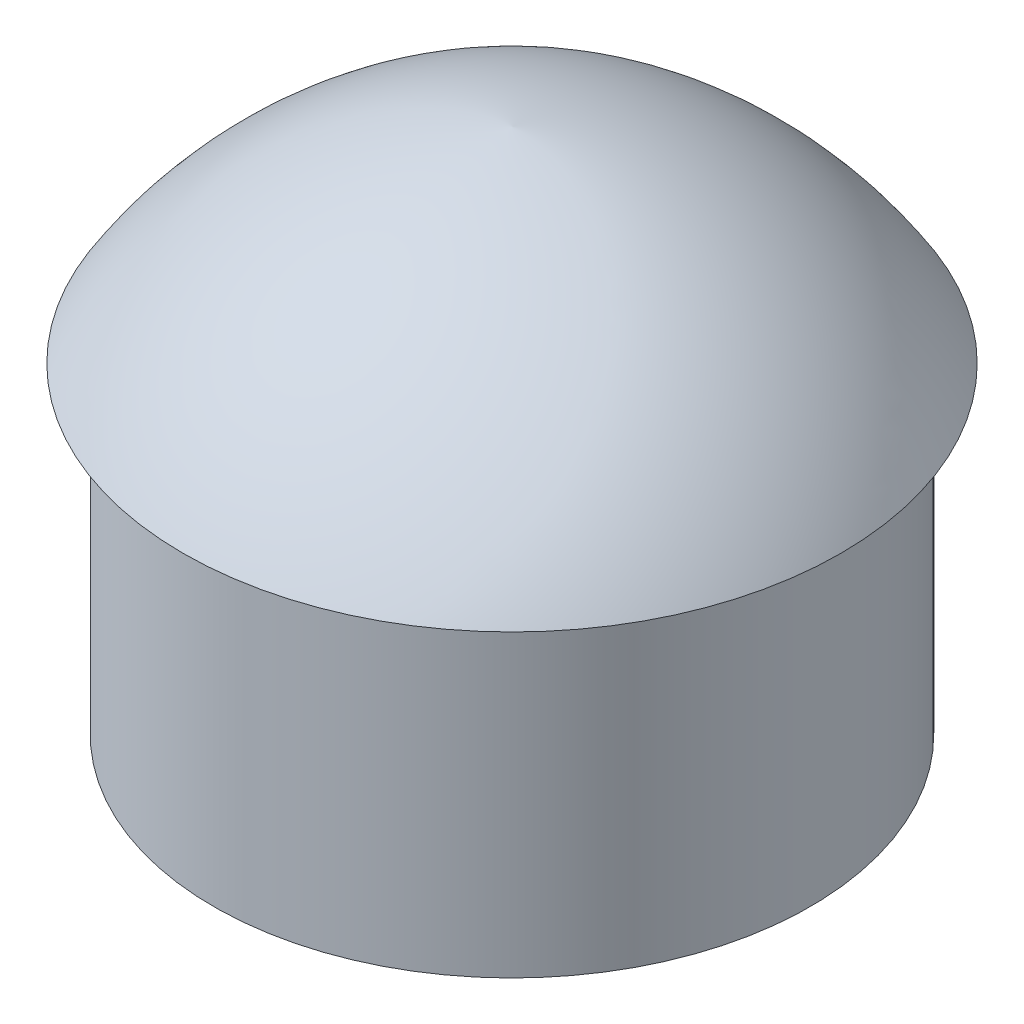
ISO-10303-21;
HEADER;
FILE_DESCRIPTION(('STEP AP214'),'2;1');
FILE_NAME('part.step','',(''),(''),'','','');
FILE_SCHEMA(('AUTOMOTIVE_DESIGN { 1 0 10303 214 1 1 1 1 }'));
ENDSEC;
DATA;
#1=APPLICATION_CONTEXT('core data for automotive mechanical design processes');
#2=APPLICATION_PROTOCOL_DEFINITION('international standard','automotive_design',2000,#1);
#3=PRODUCT_CONTEXT('',#1,'mechanical');
#4=PRODUCT('Part','Part','',(#3));
#5=PRODUCT_RELATED_PRODUCT_CATEGORY('part','',(#4));
#6=PRODUCT_DEFINITION_FORMATION('','',#4);
#7=PRODUCT_DEFINITION_CONTEXT('part definition',#1,'design');
#8=PRODUCT_DEFINITION('design','',#6,#7);
#9=PRODUCT_DEFINITION_SHAPE('','',#8);
#10=(LENGTH_UNIT() NAMED_UNIT(*) SI_UNIT(.MILLI.,.METRE.));
#11=(NAMED_UNIT(*) PLANE_ANGLE_UNIT() SI_UNIT($,.RADIAN.));
#12=(NAMED_UNIT(*) SI_UNIT($,.STERADIAN.) SOLID_ANGLE_UNIT());
#13=UNCERTAINTY_MEASURE_WITH_UNIT(LENGTH_MEASURE(1.E-05),#10,'distance_accuracy_value','');
#14=(GEOMETRIC_REPRESENTATION_CONTEXT(3) GLOBAL_UNCERTAINTY_ASSIGNED_CONTEXT((#13)) GLOBAL_UNIT_ASSIGNED_CONTEXT((#10,
#11,#12)) REPRESENTATION_CONTEXT('',''));
#15=CARTESIAN_POINT('',(0.,0.,0.));
#16=DIRECTION('',(0.,0.,1.));
#17=DIRECTION('',(1.,0.,0.));
#18=AXIS2_PLACEMENT_3D('',#15,#16,#17);
#19=CARTESIAN_POINT('',(13.6,2.65437936349018,0.));
#20=DIRECTION('',(0.,1.,0.));
#21=DIRECTION('',(-1.,0.,0.));
#22=AXIS2_PLACEMENT_3D('',#19,#20,#21);
#23=PLANE('',#22);
#24=CARTESIAN_POINT('',(0.,2.65437936349017,0.));
#25=DIRECTION('',(0.,1.,0.));
#26=DIRECTION('',(-1.,0.,0.));
#27=AXIS2_PLACEMENT_3D('',#24,#25,#26);
#28=CIRCLE('',#27,15.);
#29=CARTESIAN_POINT('',(-15.,2.65437936349017,0.));
#30=VERTEX_POINT('',#29);
#31=EDGE_CURVE('E11',#30,#30,#28,.T.);
#32=ORIENTED_EDGE('',*,*,#31,.F.);
#33=EDGE_LOOP('',(#32));
#34=FACE_BOUND('',#33,.T.);
#35=CARTESIAN_POINT('',(0.,2.65437936349017,0.));
#36=DIRECTION('',(0.,1.,0.));
#37=DIRECTION('',(-1.,0.,0.));
#38=AXIS2_PLACEMENT_3D('',#35,#36,#37);
#39=CIRCLE('',#38,13.6);
#40=CARTESIAN_POINT('',(-13.6,2.65437936349017,0.));
#41=VERTEX_POINT('',#40);
#42=EDGE_CURVE('E57',#41,#41,#39,.T.);
#43=ORIENTED_EDGE('',*,*,#42,.T.);
#44=EDGE_LOOP('',(#43));
#45=FACE_BOUND('',#44,.T.);
#46=ADVANCED_FACE('F40',(#34,#45),#23,.F.);
#47=CARTESIAN_POINT('',(1.98777575925086,-7.90097353224044,0.));
#48=DIRECTION('',(0.,0.,-1.));
#49=DIRECTION('',(-1.,0.,0.));
#50=AXIS2_PLACEMENT_3D('',#47,#48,#49);
#51=CIRCLE('',#50,20.);
#52=TRIMMED_CURVE('',#51,(PARAMETER_VALUE(-1.47124317792119)),
(PARAMETER_VALUE(1.47124317792119)),.T.,.PARAMETER.);
#53=CARTESIAN_POINT('',(0.,-7.90097353224044,0.));
#54=DIRECTION('',(0.,1.,0.));
#55=AXIS1_PLACEMENT('',#53,#54);
#56=SURFACE_OF_REVOLUTION('',#52,#55);
#57=CARTESIAN_POINT('',(0.,12.,0.));
#58=VERTEX_POINT('',#57);
#59=VERTEX_LOOP('',#58);
#60=FACE_BOUND('',#59,.T.);
#61=ORIENTED_EDGE('',*,*,#31,.T.);
#62=EDGE_LOOP('',(#61));
#63=FACE_BOUND('',#62,.T.);
#64=ADVANCED_FACE('F46',(#60,#63),#56,.T.);
#65=CARTESIAN_POINT('',(0.,-12.,0.));
#66=DIRECTION('',(0.,1.,0.));
#67=DIRECTION('',(-1.,0.,0.));
#68=AXIS2_PLACEMENT_3D('',#65,#66,#67);
#69=PLANE('',#68);
#70=CARTESIAN_POINT('',(0.,-12.,0.));
#71=DIRECTION('',(0.,1.,0.));
#72=DIRECTION('',(-1.,0.,0.));
#73=AXIS2_PLACEMENT_3D('',#70,#71,#72);
#74=CIRCLE('',#73,13.6);
#75=CARTESIAN_POINT('',(-13.6,-12.,0.));
#76=VERTEX_POINT('',#75);
#77=EDGE_CURVE('E43',#76,#76,#74,.T.);
#78=ORIENTED_EDGE('',*,*,#77,.F.);
#79=EDGE_LOOP('',(#78));
#80=FACE_BOUND('',#79,.T.);
#81=ADVANCED_FACE('F47',(#80),#69,.F.);
#82=CARTESIAN_POINT('',(0.,12.,0.));
#83=DIRECTION('',(0.,1.,0.));
#84=DIRECTION('',(-1.,0.,0.));
#85=AXIS2_PLACEMENT_3D('',#82,#83,#84);
#86=CYLINDRICAL_SURFACE('',#85,13.6);
#87=ORIENTED_EDGE('',*,*,#42,.F.);
#88=EDGE_LOOP('',(#87));
#89=FACE_BOUND('',#88,.T.);
#90=ORIENTED_EDGE('',*,*,#77,.T.);
#91=EDGE_LOOP('',(#90));
#92=FACE_BOUND('',#91,.T.);
#93=ADVANCED_FACE('F65',(#89,#92),#86,.T.);
#94=CLOSED_SHELL('',(#46,#64,#81,#93));
#95=MANIFOLD_SOLID_BREP('B2',#94);
#96=ADVANCED_BREP_SHAPE_REPRESENTATION('',(#18,#95),#14);
#97=SHAPE_DEFINITION_REPRESENTATION(#9,#96);
ENDSEC;
END-ISO-10303-21;
